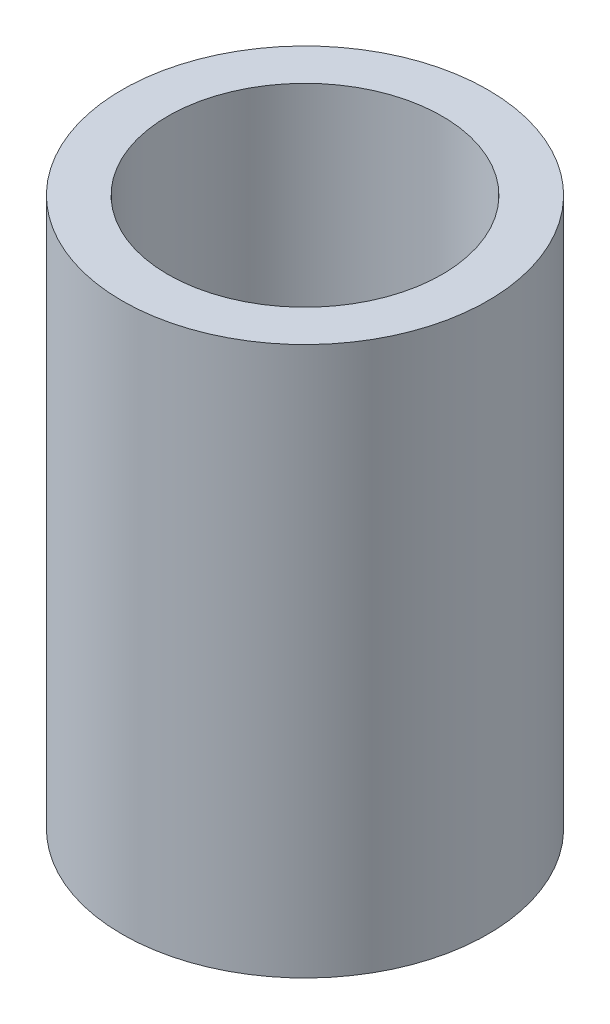
ISO-10303-21;
HEADER;
FILE_DESCRIPTION(('STEP AP214'),'2;1');
FILE_NAME('part.step','',(''),(''),'','','');
FILE_SCHEMA(('AUTOMOTIVE_DESIGN { 1 0 10303 214 1 1 1 1 }'));
ENDSEC;
DATA;
#1=APPLICATION_CONTEXT('core data for automotive mechanical design processes');
#2=APPLICATION_PROTOCOL_DEFINITION('international standard','automotive_design',2000,#1);
#3=PRODUCT_CONTEXT('',#1,'mechanical');
#4=PRODUCT('Part','Part','',(#3));
#5=PRODUCT_RELATED_PRODUCT_CATEGORY('part','',(#4));
#6=PRODUCT_DEFINITION_FORMATION('','',#4);
#7=PRODUCT_DEFINITION_CONTEXT('part definition',#1,'design');
#8=PRODUCT_DEFINITION('design','',#6,#7);
#9=PRODUCT_DEFINITION_SHAPE('','',#8);
#10=(LENGTH_UNIT() NAMED_UNIT(*) SI_UNIT(.MILLI.,.METRE.));
#11=(NAMED_UNIT(*) PLANE_ANGLE_UNIT() SI_UNIT($,.RADIAN.));
#12=(NAMED_UNIT(*) SI_UNIT($,.STERADIAN.) SOLID_ANGLE_UNIT());
#13=UNCERTAINTY_MEASURE_WITH_UNIT(LENGTH_MEASURE(1.E-05),#10,'distance_accuracy_value','');
#14=(GEOMETRIC_REPRESENTATION_CONTEXT(3) GLOBAL_UNCERTAINTY_ASSIGNED_CONTEXT((#13)) GLOBAL_UNIT_ASSIGNED_CONTEXT((#10,
#11,#12)) REPRESENTATION_CONTEXT('',''));
#15=CARTESIAN_POINT('',(0.,0.,0.));
#16=DIRECTION('',(0.,0.,1.));
#17=DIRECTION('',(1.,0.,0.));
#18=AXIS2_PLACEMENT_3D('',#15,#16,#17);
#19=CARTESIAN_POINT('',(0.,60.,0.));
#20=DIRECTION('',(0.,-1.,0.));
#21=DIRECTION('',(0.,0.,-1.));
#22=AXIS2_PLACEMENT_3D('',#19,#20,#21);
#23=CYLINDRICAL_SURFACE('',#22,20.);
#24=CARTESIAN_POINT('',(0.,60.,0.));
#25=DIRECTION('',(0.,1.,0.));
#26=DIRECTION('',(0.,0.,1.));
#27=AXIS2_PLACEMENT_3D('',#24,#25,#26);
#28=CIRCLE('',#27,20.);
#29=CARTESIAN_POINT('',(0.,60.,20.));
#30=VERTEX_POINT('',#29);
#31=EDGE_CURVE('E10',#30,#30,#28,.T.);
#32=ORIENTED_EDGE('',*,*,#31,.F.);
#33=EDGE_LOOP('',(#32));
#34=FACE_BOUND('',#33,.T.);
#35=CARTESIAN_POINT('',(0.,0.,0.));
#36=DIRECTION('',(0.,1.,0.));
#37=DIRECTION('',(0.,0.,1.));
#38=AXIS2_PLACEMENT_3D('',#35,#36,#37);
#39=CIRCLE('',#38,20.);
#40=CARTESIAN_POINT('',(0.,0.,20.));
#41=VERTEX_POINT('',#40);
#42=EDGE_CURVE('E34',#41,#41,#39,.T.);
#43=ORIENTED_EDGE('',*,*,#42,.T.);
#44=EDGE_LOOP('',(#43));
#45=FACE_BOUND('',#44,.T.);
#46=ADVANCED_FACE('F31',(#34,#45),#23,.T.);
#47=CARTESIAN_POINT('',(0.,60.,0.));
#48=DIRECTION('',(0.,1.,0.));
#49=DIRECTION('',(0.,0.,1.));
#50=AXIS2_PLACEMENT_3D('',#47,#48,#49);
#51=PLANE('',#50);
#52=CARTESIAN_POINT('',(0.,60.,0.));
#53=DIRECTION('',(0.,1.,0.));
#54=DIRECTION('',(0.,0.,1.));
#55=AXIS2_PLACEMENT_3D('',#52,#53,#54);
#56=CIRCLE('',#55,15.);
#57=CARTESIAN_POINT('',(0.,60.,15.));
#58=VERTEX_POINT('',#57);
#59=EDGE_CURVE('E43',#58,#58,#56,.T.);
#60=ORIENTED_EDGE('',*,*,#59,.F.);
#61=EDGE_LOOP('',(#60));
#62=FACE_BOUND('',#61,.T.);
#63=ORIENTED_EDGE('',*,*,#31,.T.);
#64=EDGE_LOOP('',(#63));
#65=FACE_BOUND('',#64,.T.);
#66=ADVANCED_FACE('F58',(#62,#65),#51,.T.);
#67=CARTESIAN_POINT('',(0.,0.,0.));
#68=DIRECTION('',(0.,1.,0.));
#69=DIRECTION('',(0.,0.,1.));
#70=AXIS2_PLACEMENT_3D('',#67,#68,#69);
#71=PLANE('',#70);
#72=ORIENTED_EDGE('',*,*,#42,.F.);
#73=EDGE_LOOP('',(#72));
#74=FACE_BOUND('',#73,.T.);
#75=ADVANCED_FACE('F54',(#74),#71,.F.);
#76=CARTESIAN_POINT('',(0.,5.,0.));
#77=DIRECTION('',(0.,1.,0.));
#78=DIRECTION('',(0.,0.,1.));
#79=AXIS2_PLACEMENT_3D('',#76,#77,#78);
#80=CYLINDRICAL_SURFACE('',#79,15.);
#81=CARTESIAN_POINT('',(0.,5.,0.));
#82=DIRECTION('',(0.,1.,0.));
#83=DIRECTION('',(0.,0.,1.));
#84=AXIS2_PLACEMENT_3D('',#81,#82,#83);
#85=CIRCLE('',#84,15.);
#86=CARTESIAN_POINT('',(0.,5.,15.));
#87=VERTEX_POINT('',#86);
#88=EDGE_CURVE('E41',#87,#87,#85,.T.);
#89=ORIENTED_EDGE('',*,*,#88,.F.);
#90=EDGE_LOOP('',(#89));
#91=FACE_BOUND('',#90,.T.);
#92=ORIENTED_EDGE('',*,*,#59,.T.);
#93=EDGE_LOOP('',(#92));
#94=FACE_BOUND('',#93,.T.);
#95=ADVANCED_FACE('F51',(#91,#94),#80,.F.);
#96=CARTESIAN_POINT('',(0.,5.,0.));
#97=DIRECTION('',(0.,1.,0.));
#98=DIRECTION('',(0.,0.,1.));
#99=AXIS2_PLACEMENT_3D('',#96,#97,#98);
#100=PLANE('',#99);
#101=ORIENTED_EDGE('',*,*,#88,.T.);
#102=EDGE_LOOP('',(#101));
#103=FACE_BOUND('',#102,.T.);
#104=ADVANCED_FACE('F49',(#103),#100,.T.);
#105=CLOSED_SHELL('',(#46,#66,#75,#95,#104));
#106=MANIFOLD_SOLID_BREP('B2',#105);
#107=ADVANCED_BREP_SHAPE_REPRESENTATION('',(#18,#106),#14);
#108=SHAPE_DEFINITION_REPRESENTATION(#9,#107);
ENDSEC;
END-ISO-10303-21;
